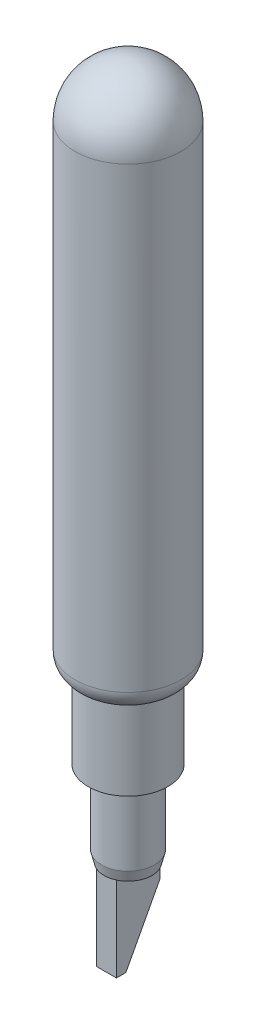
ISO-10303-21;
HEADER;
FILE_DESCRIPTION(('STEP AP214'),'2;1');
FILE_NAME('part.step','',(''),(''),'','','');
FILE_SCHEMA(('AUTOMOTIVE_DESIGN { 1 0 10303 214 1 1 1 1 }'));
ENDSEC;
DATA;
#1=APPLICATION_CONTEXT('core data for automotive mechanical design processes');
#2=APPLICATION_PROTOCOL_DEFINITION('international standard','automotive_design',2000,#1);
#3=PRODUCT_CONTEXT('',#1,'mechanical');
#4=PRODUCT('Part','Part','',(#3));
#5=PRODUCT_RELATED_PRODUCT_CATEGORY('part','',(#4));
#6=PRODUCT_DEFINITION_FORMATION('','',#4);
#7=PRODUCT_DEFINITION_CONTEXT('part definition',#1,'design');
#8=PRODUCT_DEFINITION('design','',#6,#7);
#9=PRODUCT_DEFINITION_SHAPE('','',#8);
#10=(LENGTH_UNIT() NAMED_UNIT(*) SI_UNIT(.MILLI.,.METRE.));
#11=(NAMED_UNIT(*) PLANE_ANGLE_UNIT() SI_UNIT($,.RADIAN.));
#12=(NAMED_UNIT(*) SI_UNIT($,.STERADIAN.) SOLID_ANGLE_UNIT());
#13=UNCERTAINTY_MEASURE_WITH_UNIT(LENGTH_MEASURE(1.E-05),#10,'distance_accuracy_value','');
#14=(GEOMETRIC_REPRESENTATION_CONTEXT(3) GLOBAL_UNCERTAINTY_ASSIGNED_CONTEXT((#13)) GLOBAL_UNIT_ASSIGNED_CONTEXT((#10,
#11,#12)) REPRESENTATION_CONTEXT('',''));
#15=CARTESIAN_POINT('',(0.,0.,0.));
#16=DIRECTION('',(0.,0.,1.));
#17=DIRECTION('',(1.,0.,0.));
#18=AXIS2_PLACEMENT_3D('',#15,#16,#17);
#19=CARTESIAN_POINT('',(0.,-31.,0.));
#20=DIRECTION('',(0.,-1.,0.));
#21=DIRECTION('',(0.,0.,-1.));
#22=AXIS2_PLACEMENT_3D('',#19,#20,#21);
#23=PLANE('',#22);
#24=DIRECTION('',(0.,0.,1.));
#25=VECTOR('',#24,1.);
#26=CARTESIAN_POINT('',(1.89683620836041,-31.,-4.08491892115456));
#27=LINE('',#26,#25);
#28=CARTESIAN_POINT('',(1.89683620836041,-31.,-4.08491892115456));
#29=VERTEX_POINT('',#28);
#30=CARTESIAN_POINT('',(1.89683620836041,-31.,4.08491892115456));
#31=VERTEX_POINT('',#30);
#32=EDGE_CURVE('E107',#29,#31,#27,.T.);
#33=ORIENTED_EDGE('',*,*,#32,.F.);
#34=CARTESIAN_POINT('',(0.,-31.,0.));
#35=DIRECTION('',(0.,-1.,0.));
#36=DIRECTION('',(0.,0.,-1.));
#37=AXIS2_PLACEMENT_3D('',#34,#35,#36);
#38=CIRCLE('',#37,4.50383727434214);
#39=EDGE_CURVE('E126',#29,#31,#38,.T.);
#40=ORIENTED_EDGE('',*,*,#39,.T.);
#41=EDGE_LOOP('',(#33,#40));
#42=FACE_BOUND('',#41,.T.);
#43=ADVANCED_FACE('F37',(#42),#23,.T.);
#44=DIRECTION('',(1.,0.,0.));
#45=VECTOR('',#44,1.);
#46=CARTESIAN_POINT('',(-1.89683620836041,-31.,-4.08491892115456));
#47=LINE('',#46,#45);
#48=CARTESIAN_POINT('',(-1.89683620836041,-31.,-4.08491892115456));
#49=VERTEX_POINT('',#48);
#50=EDGE_CURVE('E92',#49,#29,#47,.T.);
#51=ORIENTED_EDGE('',*,*,#50,.F.);
#52=EDGE_CURVE('E125',#49,#29,#38,.T.);
#53=ORIENTED_EDGE('',*,*,#52,.T.);
#54=EDGE_LOOP('',(#51,#53));
#55=FACE_BOUND('',#54,.T.);
#56=ADVANCED_FACE('F154',(#55),#23,.T.);
#57=DIRECTION('',(0.,0.,-1.));
#58=VECTOR('',#57,1.);
#59=CARTESIAN_POINT('',(-1.89683620836041,-31.,-4.08491892115456));
#60=LINE('',#59,#58);
#61=CARTESIAN_POINT('',(-1.89683620836041,-31.,4.08491892115456));
#62=VERTEX_POINT('',#61);
#63=EDGE_CURVE('E189',#62,#49,#60,.T.);
#64=ORIENTED_EDGE('',*,*,#63,.F.);
#65=EDGE_CURVE('E191',#62,#49,#38,.T.);
#66=ORIENTED_EDGE('',*,*,#65,.T.);
#67=EDGE_LOOP('',(#64,#66));
#68=FACE_BOUND('',#67,.T.);
#69=ADVANCED_FACE('F161',(#68),#23,.T.);
#70=CARTESIAN_POINT('',(0.,100.,0.));
#71=DIRECTION('',(0.,-1.,0.));
#72=DIRECTION('',(0.,0.,-1.));
#73=AXIS2_PLACEMENT_3D('',#70,#71,#72);
#74=CYLINDRICAL_SURFACE('',#73,10.);
#75=CARTESIAN_POINT('',(0.,90.,0.));
#76=DIRECTION('',(0.,-1.,0.));
#77=DIRECTION('',(0.,0.,-1.));
#78=AXIS2_PLACEMENT_3D('',#75,#76,#77);
#79=CIRCLE('',#78,10.);
#80=CARTESIAN_POINT('',(0.,90.,-10.));
#81=VERTEX_POINT('',#80);
#82=EDGE_CURVE('E11',#81,#81,#79,.T.);
#83=ORIENTED_EDGE('',*,*,#82,.T.);
#84=EDGE_LOOP('',(#83));
#85=FACE_BOUND('',#84,.T.);
#86=CARTESIAN_POINT('',(0.,3.70809924354784,0.));
#87=DIRECTION('',(0.,-1.,0.));
#88=DIRECTION('',(0.,0.,-1.));
#89=AXIS2_PLACEMENT_3D('',#86,#87,#88);
#90=CIRCLE('',#89,10.);
#91=CARTESIAN_POINT('',(0.,3.70809924354784,-10.));
#92=VERTEX_POINT('',#91);
#93=EDGE_CURVE('E119',#92,#92,#90,.F.);
#94=ORIENTED_EDGE('',*,*,#93,.T.);
#95=EDGE_LOOP('',(#94));
#96=FACE_BOUND('',#95,.T.);
#97=ADVANCED_FACE('F179',(#85,#96),#74,.T.);
#98=CARTESIAN_POINT('',(0.,-15.,0.));
#99=DIRECTION('',(0.,1.,0.));
#100=DIRECTION('',(0.,0.,1.));
#101=AXIS2_PLACEMENT_3D('',#98,#99,#100);
#102=CYLINDRICAL_SURFACE('',#101,7.5);
#103=CARTESIAN_POINT('',(0.,-15.,0.));
#104=DIRECTION('',(0.,-1.,0.));
#105=DIRECTION('',(0.,0.,-1.));
#106=AXIS2_PLACEMENT_3D('',#103,#104,#105);
#107=CIRCLE('',#106,7.5);
#108=CARTESIAN_POINT('',(0.,-15.,-7.5));
#109=VERTEX_POINT('',#108);
#110=EDGE_CURVE('E108',#109,#109,#107,.T.);
#111=ORIENTED_EDGE('',*,*,#110,.F.);
#112=EDGE_LOOP('',(#111));
#113=FACE_BOUND('',#112,.T.);
#114=CARTESIAN_POINT('',(0.,0.,0.));
#115=DIRECTION('',(0.,-1.,0.));
#116=DIRECTION('',(0.,0.,-1.));
#117=AXIS2_PLACEMENT_3D('',#114,#115,#116);
#118=CIRCLE('',#117,7.5);
#119=CARTESIAN_POINT('',(0.,0.,-7.5));
#120=VERTEX_POINT('',#119);
#121=EDGE_CURVE('E111',#120,#120,#118,.T.);
#122=ORIENTED_EDGE('',*,*,#121,.T.);
#123=EDGE_LOOP('',(#122));
#124=FACE_BOUND('',#123,.T.);
#125=ADVANCED_FACE('F184',(#113,#124),#102,.T.);
#126=CARTESIAN_POINT('',(0.,-15.,0.));
#127=DIRECTION('',(0.,-1.,0.));
#128=DIRECTION('',(0.,0.,-1.));
#129=AXIS2_PLACEMENT_3D('',#126,#127,#128);
#130=PLANE('',#129);
#131=CARTESIAN_POINT('',(0.,-15.,0.));
#132=DIRECTION('',(0.,-1.,0.));
#133=DIRECTION('',(0.,0.,-1.));
#134=AXIS2_PLACEMENT_3D('',#131,#132,#133);
#135=CIRCLE('',#134,5.);
#136=CARTESIAN_POINT('',(0.,-15.,-5.));
#137=VERTEX_POINT('',#136);
#138=EDGE_CURVE('E117',#137,#137,#135,.T.);
#139=ORIENTED_EDGE('',*,*,#138,.F.);
#140=EDGE_LOOP('',(#139));
#141=FACE_BOUND('',#140,.T.);
#142=ORIENTED_EDGE('',*,*,#110,.T.);
#143=EDGE_LOOP('',(#142));
#144=FACE_BOUND('',#143,.T.);
#145=ADVANCED_FACE('F176',(#141,#144),#130,.T.);
#146=CARTESIAN_POINT('',(0.,-31.,0.));
#147=DIRECTION('',(0.,1.,0.));
#148=DIRECTION('',(0.,0.,1.));
#149=AXIS2_PLACEMENT_3D('',#146,#147,#148);
#150=CYLINDRICAL_SURFACE('',#149,5.);
#151=CARTESIAN_POINT('',(0.,-29.0100000000002,0.));
#152=DIRECTION('',(0.,-1.,0.));
#153=DIRECTION('',(0.,0.,-1.));
#154=AXIS2_PLACEMENT_3D('',#151,#152,#153);
#155=CIRCLE('',#154,5.);
#156=CARTESIAN_POINT('',(0.,-29.0100000000002,-5.));
#157=VERTEX_POINT('',#156);
#158=EDGE_CURVE('E129',#157,#157,#155,.F.);
#159=ORIENTED_EDGE('',*,*,#158,.T.);
#160=EDGE_LOOP('',(#159));
#161=FACE_BOUND('',#160,.T.);
#162=ORIENTED_EDGE('',*,*,#138,.T.);
#163=EDGE_LOOP('',(#162));
#164=FACE_BOUND('',#163,.T.);
#165=ADVANCED_FACE('F167',(#161,#164),#150,.T.);
#166=DIRECTION('',(-1.,0.,0.));
#167=VECTOR('',#166,1.);
#168=CARTESIAN_POINT('',(-1.89683620836041,-31.,4.08491892115456));
#169=LINE('',#168,#167);
#170=EDGE_CURVE('E192',#31,#62,#169,.T.);
#171=ORIENTED_EDGE('',*,*,#170,.F.);
#172=EDGE_CURVE('E130',#31,#62,#38,.T.);
#173=ORIENTED_EDGE('',*,*,#172,.T.);
#174=EDGE_LOOP('',(#171,#173));
#175=FACE_BOUND('',#174,.T.);
#176=ADVANCED_FACE('F157',(#175),#23,.T.);
#177=CARTESIAN_POINT('',(0.,3.70809924354783,0.));
#178=DIRECTION('',(0.,-1.,0.));
#179=DIRECTION('',(0.,0.,-1.));
#180=AXIS2_PLACEMENT_3D('',#177,#178,#179);
#181=TOROIDAL_SURFACE('',#180,6.,4.);
#182=ORIENTED_EDGE('',*,*,#121,.F.);
#183=EDGE_LOOP('',(#182));
#184=FACE_BOUND('',#183,.T.);
#185=ORIENTED_EDGE('',*,*,#93,.F.);
#186=EDGE_LOOP('',(#185));
#187=FACE_BOUND('',#186,.T.);
#188=ADVANCED_FACE('F166',(#184,#187),#181,.T.);
#189=CARTESIAN_POINT('',(0.,-31.,0.));
#190=DIRECTION('',(0.,1.,0.));
#191=DIRECTION('',(0.,0.,1.));
#192=AXIS2_PLACEMENT_3D('',#189,#190,#191);
#193=CONICAL_SURFACE('',#192,4.50383727434214,0.244346095279202);
#194=ORIENTED_EDGE('',*,*,#158,.F.);
#195=EDGE_LOOP('',(#194));
#196=FACE_BOUND('',#195,.T.);
#197=ORIENTED_EDGE('',*,*,#39,.F.);
#198=ORIENTED_EDGE('',*,*,#52,.F.);
#199=ORIENTED_EDGE('',*,*,#65,.F.);
#200=ORIENTED_EDGE('',*,*,#172,.F.);
#201=EDGE_LOOP('',(#197,#198,#199,#200));
#202=FACE_BOUND('',#201,.T.);
#203=ADVANCED_FACE('F173',(#196,#202),#193,.T.);
#204=CARTESIAN_POINT('',(1.89683620836041,-47.,-4.08491892115456));
#205=DIRECTION('',(-1.,0.,0.));
#206=DIRECTION('',(0.,0.,1.));
#207=AXIS2_PLACEMENT_3D('',#204,#205,#206);
#208=PLANE('',#207);
#209=DIRECTION('',(0.,0.,1.));
#210=VECTOR('',#209,1.);
#211=CARTESIAN_POINT('',(1.89683620836041,-47.,-4.08491892115456));
#212=LINE('',#211,#210);
#213=CARTESIAN_POINT('',(1.89683620836041,-47.,2.29559425878321));
#214=VERTEX_POINT('',#213);
#215=CARTESIAN_POINT('',(1.89683620836041,-47.,4.08491892115456));
#216=VERTEX_POINT('',#215);
#217=EDGE_CURVE('E83',#214,#216,#212,.T.);
#218=ORIENTED_EDGE('',*,*,#217,.F.);
#219=DIRECTION('',(0.,-0.882947592858928,0.469471562785889));
#220=VECTOR('',#219,1.);
#221=CARTESIAN_POINT('',(1.89683620836041,-47.,2.29559425878321));
#222=LINE('',#221,#220);
#223=CARTESIAN_POINT('',(1.89683620836041,-34.9999999999999,-4.08491892115456));
#224=VERTEX_POINT('',#223);
#225=EDGE_CURVE('E60',#214,#224,#222,.F.);
#226=ORIENTED_EDGE('',*,*,#225,.T.);
#227=DIRECTION('',(0.,1.,0.));
#228=VECTOR('',#227,1.);
#229=CARTESIAN_POINT('',(1.89683620836041,-47.,-4.08491892115456));
#230=LINE('',#229,#228);
#231=EDGE_CURVE('E140',#224,#29,#230,.T.);
#232=ORIENTED_EDGE('',*,*,#231,.T.);
#233=ORIENTED_EDGE('',*,*,#32,.T.);
#234=DIRECTION('',(0.,1.,0.));
#235=VECTOR('',#234,1.);
#236=CARTESIAN_POINT('',(1.89683620836041,-47.,4.08491892115456));
#237=LINE('',#236,#235);
#238=EDGE_CURVE('E98',#216,#31,#237,.T.);
#239=ORIENTED_EDGE('',*,*,#238,.F.);
#240=EDGE_LOOP('',(#218,#226,#232,#233,#239));
#241=FACE_BOUND('',#240,.T.);
#242=ADVANCED_FACE('F105',(#241),#208,.F.);
#243=CARTESIAN_POINT('',(-1.89683620836041,-47.,4.08491892115456));
#244=DIRECTION('',(0.,0.,-1.));
#245=DIRECTION('',(-1.,0.,0.));
#246=AXIS2_PLACEMENT_3D('',#243,#244,#245);
#247=PLANE('',#246);
#248=ORIENTED_EDGE('',*,*,#170,.T.);
#249=DIRECTION('',(0.,1.,0.));
#250=VECTOR('',#249,1.);
#251=CARTESIAN_POINT('',(-1.89683620836041,-47.,4.08491892115456));
#252=LINE('',#251,#250);
#253=CARTESIAN_POINT('',(-1.89683620836041,-47.,4.08491892115456));
#254=VERTEX_POINT('',#253);
#255=EDGE_CURVE('E101',#254,#62,#252,.T.);
#256=ORIENTED_EDGE('',*,*,#255,.F.);
#257=DIRECTION('',(-1.,0.,0.));
#258=VECTOR('',#257,1.);
#259=CARTESIAN_POINT('',(-1.89683620836041,-47.,4.08491892115456));
#260=LINE('',#259,#258);
#261=EDGE_CURVE('E87',#216,#254,#260,.T.);
#262=ORIENTED_EDGE('',*,*,#261,.F.);
#263=ORIENTED_EDGE('',*,*,#238,.T.);
#264=EDGE_LOOP('',(#248,#256,#262,#263));
#265=FACE_BOUND('',#264,.T.);
#266=ADVANCED_FACE('F97',(#265),#247,.F.);
#267=CARTESIAN_POINT('',(-1.89683620836041,-47.,-4.08491892115456));
#268=DIRECTION('',(1.,0.,0.));
#269=DIRECTION('',(0.,0.,-1.));
#270=AXIS2_PLACEMENT_3D('',#267,#268,#269);
#271=PLANE('',#270);
#272=DIRECTION('',(0.,1.,0.));
#273=VECTOR('',#272,1.);
#274=CARTESIAN_POINT('',(-1.89683620836041,-47.,-4.08491892115456));
#275=LINE('',#274,#273);
#276=CARTESIAN_POINT('',(-1.89683620836041,-34.9999999999999,-4.08491892115456));
#277=VERTEX_POINT('',#276);
#278=EDGE_CURVE('E113',#277,#49,#275,.T.);
#279=ORIENTED_EDGE('',*,*,#278,.F.);
#280=DIRECTION('',(0.,0.882947592858928,-0.469471562785889));
#281=VECTOR('',#280,1.);
#282=CARTESIAN_POINT('',(-1.89683620836041,-47.,2.29559425878321));
#283=LINE('',#282,#281);
#284=CARTESIAN_POINT('',(-1.89683620836041,-47.,2.29559425878321));
#285=VERTEX_POINT('',#284);
#286=EDGE_CURVE('E45',#277,#285,#283,.F.);
#287=ORIENTED_EDGE('',*,*,#286,.T.);
#288=DIRECTION('',(0.,0.,-1.));
#289=VECTOR('',#288,1.);
#290=CARTESIAN_POINT('',(-1.89683620836041,-47.,-4.08491892115456));
#291=LINE('',#290,#289);
#292=EDGE_CURVE('E103',#254,#285,#291,.T.);
#293=ORIENTED_EDGE('',*,*,#292,.F.);
#294=ORIENTED_EDGE('',*,*,#255,.T.);
#295=ORIENTED_EDGE('',*,*,#63,.T.);
#296=EDGE_LOOP('',(#279,#287,#293,#294,#295));
#297=FACE_BOUND('',#296,.T.);
#298=ADVANCED_FACE('F137',(#297),#271,.F.);
#299=CARTESIAN_POINT('',(-1.89683620836041,-47.,-4.08491892115456));
#300=DIRECTION('',(0.,0.,1.));
#301=DIRECTION('',(1.,0.,0.));
#302=AXIS2_PLACEMENT_3D('',#299,#300,#301);
#303=PLANE('',#302);
#304=ORIENTED_EDGE('',*,*,#231,.F.);
#305=DIRECTION('',(-1.,0.,0.));
#306=VECTOR('',#305,1.);
#307=CARTESIAN_POINT('',(-1.89683620836041,-34.9999999999999,-4.08491892115456));
#308=LINE('',#307,#306);
#309=EDGE_CURVE('E52',#224,#277,#308,.T.);
#310=ORIENTED_EDGE('',*,*,#309,.T.);
#311=ORIENTED_EDGE('',*,*,#278,.T.);
#312=ORIENTED_EDGE('',*,*,#50,.T.);
#313=EDGE_LOOP('',(#304,#310,#311,#312));
#314=FACE_BOUND('',#313,.T.);
#315=ADVANCED_FACE('F149',(#314),#303,.F.);
#316=CARTESIAN_POINT('',(0.,-47.,0.));
#317=DIRECTION('',(0.,1.,0.));
#318=DIRECTION('',(0.,0.,1.));
#319=AXIS2_PLACEMENT_3D('',#316,#317,#318);
#320=PLANE('',#319);
#321=ORIENTED_EDGE('',*,*,#292,.T.);
#322=DIRECTION('',(1.,0.,0.));
#323=VECTOR('',#322,1.);
#324=CARTESIAN_POINT('',(0.,-47.,2.29559425878321));
#325=LINE('',#324,#323);
#326=EDGE_CURVE('E90',#285,#214,#325,.T.);
#327=ORIENTED_EDGE('',*,*,#326,.T.);
#328=ORIENTED_EDGE('',*,*,#217,.T.);
#329=ORIENTED_EDGE('',*,*,#261,.T.);
#330=EDGE_LOOP('',(#321,#327,#328,#329));
#331=FACE_BOUND('',#330,.T.);
#332=ADVANCED_FACE('F86',(#331),#320,.F.);
#333=CARTESIAN_POINT('',(0.,-47.,2.29559425878321));
#334=DIRECTION('',(0.,0.469471562785889,0.882947592858928));
#335=DIRECTION('',(1.,0.,0.));
#336=AXIS2_PLACEMENT_3D('',#333,#334,#335);
#337=PLANE('',#336);
#338=ORIENTED_EDGE('',*,*,#286,.F.);
#339=ORIENTED_EDGE('',*,*,#309,.F.);
#340=ORIENTED_EDGE('',*,*,#225,.F.);
#341=ORIENTED_EDGE('',*,*,#326,.F.);
#342=EDGE_LOOP('',(#338,#339,#340,#341));
#343=FACE_BOUND('',#342,.T.);
#344=ADVANCED_FACE('F142',(#343),#337,.F.);
#345=CARTESIAN_POINT('',(0.,90.,0.));
#346=DIRECTION('',(0.,1.,0.));
#347=DIRECTION('',(0.,0.,1.));
#348=AXIS2_PLACEMENT_3D('',#345,#346,#347);
#349=SPHERICAL_SURFACE('',#348,10.);
#350=ORIENTED_EDGE('',*,*,#82,.F.);
#351=EDGE_LOOP('',(#350));
#352=FACE_BOUND('',#351,.T.);
#353=ADVANCED_FACE('F39',(#352),#349,.T.);
#354=CLOSED_SHELL('',(#43,#56,#69,#97,#125,#145,#165,#176,#188,#203,#242,#266,#298,#315,#332,
#344,#353));
#355=MANIFOLD_SOLID_BREP('B2',#354);
#356=ADVANCED_BREP_SHAPE_REPRESENTATION('',(#18,#355),#14);
#357=SHAPE_DEFINITION_REPRESENTATION(#9,#356);
ENDSEC;
END-ISO-10303-21;
